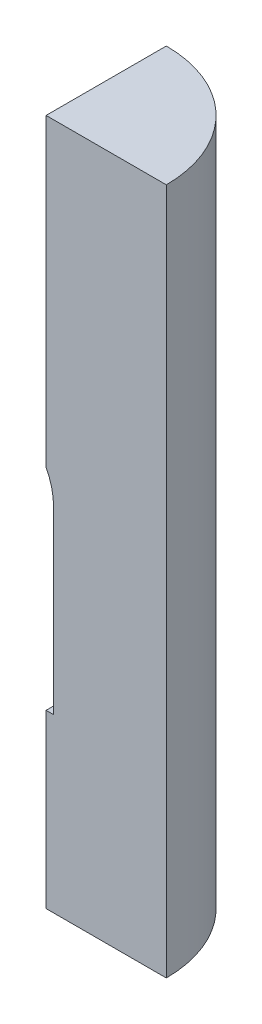
ISO-10303-21;
HEADER;
FILE_DESCRIPTION(('STEP AP214'),'2;1');
FILE_NAME('part.step','',(''),(''),'','','');
FILE_SCHEMA(('AUTOMOTIVE_DESIGN { 1 0 10303 214 1 1 1 1 }'));
ENDSEC;
DATA;
#1=APPLICATION_CONTEXT('core data for automotive mechanical design processes');
#2=APPLICATION_PROTOCOL_DEFINITION('international standard','automotive_design',2000,#1);
#3=PRODUCT_CONTEXT('',#1,'mechanical');
#4=PRODUCT('Part','Part','',(#3));
#5=PRODUCT_RELATED_PRODUCT_CATEGORY('part','',(#4));
#6=PRODUCT_DEFINITION_FORMATION('','',#4);
#7=PRODUCT_DEFINITION_CONTEXT('part definition',#1,'design');
#8=PRODUCT_DEFINITION('design','',#6,#7);
#9=PRODUCT_DEFINITION_SHAPE('','',#8);
#10=(LENGTH_UNIT() NAMED_UNIT(*) SI_UNIT(.MILLI.,.METRE.));
#11=(NAMED_UNIT(*) PLANE_ANGLE_UNIT() SI_UNIT($,.RADIAN.));
#12=(NAMED_UNIT(*) SI_UNIT($,.STERADIAN.) SOLID_ANGLE_UNIT());
#13=UNCERTAINTY_MEASURE_WITH_UNIT(LENGTH_MEASURE(1.E-05),#10,'distance_accuracy_value','');
#14=(GEOMETRIC_REPRESENTATION_CONTEXT(3) GLOBAL_UNCERTAINTY_ASSIGNED_CONTEXT((#13)) GLOBAL_UNIT_ASSIGNED_CONTEXT((#10,
#11,#12)) REPRESENTATION_CONTEXT('',''));
#15=CARTESIAN_POINT('',(0.,0.,0.));
#16=DIRECTION('',(0.,0.,1.));
#17=DIRECTION('',(1.,0.,0.));
#18=AXIS2_PLACEMENT_3D('',#15,#16,#17);
#19=CARTESIAN_POINT('',(0.,3000.,0.));
#20=DIRECTION('',(1.,0.,0.));
#21=DIRECTION('',(0.,0.,-1.));
#22=AXIS2_PLACEMENT_3D('',#19,#20,#21);
#23=PLANE('',#22);
#24=DIRECTION('',(0.,0.,1.));
#25=VECTOR('',#24,1.);
#26=CARTESIAN_POINT('',(0.,0.,0.));
#27=LINE('',#26,#25);
#28=CARTESIAN_POINT('',(0.,0.,-43.5));
#29=VERTEX_POINT('',#28);
#30=CARTESIAN_POINT('',(0.,0.,0.));
#31=VERTEX_POINT('',#30);
#32=EDGE_CURVE('E444',#29,#31,#27,.T.);
#33=ORIENTED_EDGE('',*,*,#32,.F.);
#34=DIRECTION('',(0.,1.,0.));
#35=VECTOR('',#34,1.);
#36=CARTESIAN_POINT('',(0.,1225.,-43.5));
#37=LINE('',#36,#35);
#38=CARTESIAN_POINT('',(0.,1050.,-43.5));
#39=VERTEX_POINT('',#38);
#40=EDGE_CURVE('E437',#39,#29,#37,.F.);
#41=ORIENTED_EDGE('',*,*,#40,.F.);
#42=CARTESIAN_POINT('',(0.,1050.,330.261494252874));
#43=DIRECTION('',(1.,0.,0.));
#44=DIRECTION('',(0.,0.,-1.));
#45=AXIS2_PLACEMENT_3D('',#42,#43,#44);
#46=CIRCLE('',#45,373.761494252874);
#47=CARTESIAN_POINT('',(0.,1225.,0.));
#48=VERTEX_POINT('',#47);
#49=EDGE_CURVE('E440',#48,#39,#46,.F.);
#50=ORIENTED_EDGE('',*,*,#49,.F.);
#51=DIRECTION('',(0.,-1.,0.));
#52=VECTOR('',#51,1.);
#53=CARTESIAN_POINT('',(0.,3000.,0.));
#54=LINE('',#53,#52);
#55=CARTESIAN_POINT('',(0.,3000.,0.));
#56=VERTEX_POINT('',#55);
#57=EDGE_CURVE('E467',#56,#48,#54,.T.);
#58=ORIENTED_EDGE('',*,*,#57,.F.);
#59=DIRECTION('',(0.,0.,1.));
#60=VECTOR('',#59,1.);
#61=CARTESIAN_POINT('',(0.,3000.,0.));
#62=LINE('',#61,#60);
#63=CARTESIAN_POINT('',(0.,3000.,-700.));
#64=VERTEX_POINT('',#63);
#65=EDGE_CURVE('E455',#64,#56,#62,.T.);
#66=ORIENTED_EDGE('',*,*,#65,.F.);
#67=DIRECTION('',(0.,-1.,0.));
#68=VECTOR('',#67,1.);
#69=CARTESIAN_POINT('',(0.,3000.,-700.));
#70=LINE('',#69,#68);
#71=CARTESIAN_POINT('',(0.,-1000.,-700.));
#72=VERTEX_POINT('',#71);
#73=EDGE_CURVE('E462',#64,#72,#70,.T.);
#74=ORIENTED_EDGE('',*,*,#73,.T.);
#75=DIRECTION('',(0.,0.,1.));
#76=VECTOR('',#75,1.);
#77=CARTESIAN_POINT('',(0.,-1000.,0.));
#78=LINE('',#77,#76);
#79=CARTESIAN_POINT('',(0.,-1000.,0.));
#80=VERTEX_POINT('',#79);
#81=EDGE_CURVE('E446',#72,#80,#78,.T.);
#82=ORIENTED_EDGE('',*,*,#81,.T.);
#83=EDGE_CURVE('E466',#31,#80,#54,.T.);
#84=ORIENTED_EDGE('',*,*,#83,.F.);
#85=EDGE_LOOP('',(#33,#41,#50,#58,#66,#74,#82,#84));
#86=FACE_BOUND('',#85,.T.);
#87=ADVANCED_FACE('F97',(#86),#23,.F.);
#88=CARTESIAN_POINT('',(700.,3000.,0.));
#89=DIRECTION('',(0.,0.,-1.));
#90=DIRECTION('',(-1.,0.,0.));
#91=AXIS2_PLACEMENT_3D('',#88,#89,#90);
#92=PLANE('',#91);
#93=DIRECTION('',(1.,0.,0.));
#94=VECTOR('',#93,1.);
#95=CARTESIAN_POINT('',(700.,0.,0.));
#96=LINE('',#95,#94);
#97=CARTESIAN_POINT('',(43.5,0.,0.));
#98=VERTEX_POINT('',#97);
#99=EDGE_CURVE('E399',#31,#98,#96,.T.);
#100=ORIENTED_EDGE('',*,*,#99,.F.);
#101=ORIENTED_EDGE('',*,*,#83,.T.);
#102=DIRECTION('',(1.,0.,0.));
#103=VECTOR('',#102,1.);
#104=CARTESIAN_POINT('',(700.,-1000.,0.));
#105=LINE('',#104,#103);
#106=CARTESIAN_POINT('',(700.,-1000.,0.));
#107=VERTEX_POINT('',#106);
#108=EDGE_CURVE('E449',#80,#107,#105,.T.);
#109=ORIENTED_EDGE('',*,*,#108,.T.);
#110=DIRECTION('',(0.,-1.,0.));
#111=VECTOR('',#110,1.);
#112=CARTESIAN_POINT('',(700.,3000.,0.));
#113=LINE('',#112,#111);
#114=CARTESIAN_POINT('',(700.,3000.,0.));
#115=VERTEX_POINT('',#114);
#116=EDGE_CURVE('E464',#115,#107,#113,.T.);
#117=ORIENTED_EDGE('',*,*,#116,.F.);
#118=DIRECTION('',(1.,0.,0.));
#119=VECTOR('',#118,1.);
#120=CARTESIAN_POINT('',(700.,3000.,0.));
#121=LINE('',#120,#119);
#122=EDGE_CURVE('E458',#56,#115,#121,.T.);
#123=ORIENTED_EDGE('',*,*,#122,.F.);
#124=ORIENTED_EDGE('',*,*,#57,.T.);
#125=CARTESIAN_POINT('',(-330.261494252874,1050.,0.));
#126=DIRECTION('',(0.,0.,-1.));
#127=DIRECTION('',(-1.,0.,0.));
#128=AXIS2_PLACEMENT_3D('',#125,#126,#127);
#129=CIRCLE('',#128,373.761494252874);
#130=CARTESIAN_POINT('',(43.5,1050.,0.));
#131=VERTEX_POINT('',#130);
#132=EDGE_CURVE('E470',#131,#48,#129,.F.);
#133=ORIENTED_EDGE('',*,*,#132,.F.);
#134=DIRECTION('',(0.,1.,0.));
#135=VECTOR('',#134,1.);
#136=CARTESIAN_POINT('',(43.5,1225.,0.));
#137=LINE('',#136,#135);
#138=EDGE_CURVE('E471',#98,#131,#137,.T.);
#139=ORIENTED_EDGE('',*,*,#138,.F.);
#140=EDGE_LOOP('',(#100,#101,#109,#117,#123,#124,#133,#139));
#141=FACE_BOUND('',#140,.T.);
#142=ADVANCED_FACE('F477',(#141),#92,.F.);
#143=CARTESIAN_POINT('',(0.,3000.,0.));
#144=DIRECTION('',(0.,-1.,0.));
#145=DIRECTION('',(0.,0.,-1.));
#146=AXIS2_PLACEMENT_3D('',#143,#144,#145);
#147=CYLINDRICAL_SURFACE('',#146,700.);
#148=ORIENTED_EDGE('',*,*,#116,.T.);
#149=CARTESIAN_POINT('',(0.,-1000.,0.));
#150=DIRECTION('',(0.,1.,0.));
#151=DIRECTION('',(0.,0.,1.));
#152=AXIS2_PLACEMENT_3D('',#149,#150,#151);
#153=CIRCLE('',#152,700.);
#154=EDGE_CURVE('E452',#107,#72,#153,.T.);
#155=ORIENTED_EDGE('',*,*,#154,.T.);
#156=ORIENTED_EDGE('',*,*,#73,.F.);
#157=CARTESIAN_POINT('',(0.,3000.,0.));
#158=DIRECTION('',(0.,1.,0.));
#159=DIRECTION('',(0.,0.,1.));
#160=AXIS2_PLACEMENT_3D('',#157,#158,#159);
#161=CIRCLE('',#160,700.);
#162=EDGE_CURVE('E460',#115,#64,#161,.T.);
#163=ORIENTED_EDGE('',*,*,#162,.F.);
#164=EDGE_LOOP('',(#148,#155,#156,#163));
#165=FACE_BOUND('',#164,.T.);
#166=ADVANCED_FACE('F490',(#165),#147,.T.);
#167=CARTESIAN_POINT('',(0.,3000.,0.));
#168=DIRECTION('',(0.,1.,0.));
#169=DIRECTION('',(0.,0.,1.));
#170=AXIS2_PLACEMENT_3D('',#167,#168,#169);
#171=PLANE('',#170);
#172=ORIENTED_EDGE('',*,*,#65,.T.);
#173=ORIENTED_EDGE('',*,*,#122,.T.);
#174=ORIENTED_EDGE('',*,*,#162,.T.);
#175=EDGE_LOOP('',(#172,#173,#174));
#176=FACE_BOUND('',#175,.T.);
#177=ADVANCED_FACE('F493',(#176),#171,.T.);
#178=CARTESIAN_POINT('',(0.,-1000.,0.));
#179=DIRECTION('',(0.,1.,0.));
#180=DIRECTION('',(0.,0.,1.));
#181=AXIS2_PLACEMENT_3D('',#178,#179,#180);
#182=PLANE('',#181);
#183=ORIENTED_EDGE('',*,*,#81,.F.);
#184=ORIENTED_EDGE('',*,*,#154,.F.);
#185=ORIENTED_EDGE('',*,*,#108,.F.);
#186=EDGE_LOOP('',(#183,#184,#185));
#187=FACE_BOUND('',#186,.T.);
#188=ADVANCED_FACE('F487',(#187),#182,.F.);
#189=CARTESIAN_POINT('',(0.,0.,0.));
#190=DIRECTION('',(0.,1.,0.));
#191=DIRECTION('',(0.,0.,1.));
#192=AXIS2_PLACEMENT_3D('',#189,#190,#191);
#193=PLANE('',#192);
#194=ORIENTED_EDGE('',*,*,#32,.T.);
#195=ORIENTED_EDGE('',*,*,#99,.T.);
#196=CARTESIAN_POINT('',(0.,0.,0.));
#197=DIRECTION('',(0.,1.,0.));
#198=DIRECTION('',(0.,0.,1.));
#199=AXIS2_PLACEMENT_3D('',#196,#197,#198);
#200=CIRCLE('',#199,43.5);
#201=CARTESIAN_POINT('',(31.4581230245567,0.,-30.0439094621831));
#202=VERTEX_POINT('',#201);
#203=EDGE_CURVE('E422',#98,#202,#200,.T.);
#204=ORIENTED_EDGE('',*,*,#203,.T.);
#205=DIRECTION('',(0.707106781186554,0.,-0.707106781186541));
#206=VECTOR('',#205,1.);
#207=CARTESIAN_POINT('',(74.9533188057747,0.,-73.5391052434003));
#208=LINE('',#207,#206);
#209=CARTESIAN_POINT('',(149.199530830363,0.,-147.785317267987));
#210=VERTEX_POINT('',#209);
#211=EDGE_CURVE('E223',#202,#210,#208,.T.);
#212=ORIENTED_EDGE('',*,*,#211,.T.);
#213=DIRECTION('',(-0.707106781186547,0.,-0.707106781186547));
#214=VECTOR('',#213,1.);
#215=CARTESIAN_POINT('',(147.78531726799,0.,-149.19953083036));
#216=LINE('',#215,#214);
#217=CARTESIAN_POINT('',(147.78531726799,0.,-149.19953083036));
#218=VERTEX_POINT('',#217);
#219=EDGE_CURVE('E281',#210,#218,#216,.T.);
#220=ORIENTED_EDGE('',*,*,#219,.T.);
#221=DIRECTION('',(-0.707106781186554,0.,0.707106781186541));
#222=VECTOR('',#221,1.);
#223=CARTESIAN_POINT('',(73.5391052434016,0.,-74.9533188057734));
#224=LINE('',#223,#222);
#225=CARTESIAN_POINT('',(30.0439094621836,0.,-31.4581230245562));
#226=VERTEX_POINT('',#225);
#227=EDGE_CURVE('E364',#218,#226,#224,.T.);
#228=ORIENTED_EDGE('',*,*,#227,.T.);
#229=EDGE_CURVE('E435',#226,#29,#200,.T.);
#230=ORIENTED_EDGE('',*,*,#229,.T.);
#231=EDGE_LOOP('',(#194,#195,#204,#212,#220,#228,#230));
#232=FACE_BOUND('',#231,.T.);
#233=ADVANCED_FACE('F404',(#232),#193,.T.);
#234=CARTESIAN_POINT('',(0.,1225.,0.));
#235=DIRECTION('',(0.,1.,0.));
#236=DIRECTION('',(0.,0.,1.));
#237=AXIS2_PLACEMENT_3D('',#234,#235,#236);
#238=CYLINDRICAL_SURFACE('',#237,43.5);
#239=CARTESIAN_POINT('',(31.4581230245567,0.,-30.0439094621831));
#240=CARTESIAN_POINT('',(31.5658679017557,1.24177976317339,-29.9310907334763));
#241=CARTESIAN_POINT('',(31.6691032084224,2.48427472720864,-29.8217828292401));
#242=CARTESIAN_POINT('',(31.8664585476178,4.97066705871609,-29.6108041272958));
#243=CARTESIAN_POINT('',(31.9605783515092,6.21456446057334,-29.5091335211624));
#244=CARTESIAN_POINT('',(32.1396018071558,8.70368068165048,-29.3140498645286));
#245=CARTESIAN_POINT('',(32.2245053900726,9.9488995106703,-29.2206368757074));
#246=CARTESIAN_POINT('',(32.3850610344528,12.4401919203471,-29.0425927501225));
#247=CARTESIAN_POINT('',(32.4607158102099,13.6862651417846,-28.9579590379703));
#248=CARTESIAN_POINT('',(32.6028801142698,16.1795051961954,-28.7978067813483));
#249=CARTESIAN_POINT('',(32.6693897404492,17.4266720173206,-28.7222881393249));
#250=CARTESIAN_POINT('',(32.7934522595879,19.9219622394534,-28.5805592356351));
#251=CARTESIAN_POINT('',(32.8510052822949,21.1700856263408,-28.5143488391285));
#252=CARTESIAN_POINT('',(32.944287726564,23.3579649078937,-28.4064718784471));
#253=CARTESIAN_POINT('',(32.9818920624438,24.2975425698529,-28.3627876827162));
#254=CARTESIAN_POINT('',(33.052392924862,26.1770972615826,-28.2805985703607));
#255=CARTESIAN_POINT('',(33.0852894702768,27.1170742897368,-28.2420936329696));
#256=CARTESIAN_POINT('',(33.1465973569412,28.997394783179,-28.1701139759049));
#257=CARTESIAN_POINT('',(33.1750085638879,29.9377382585945,-28.1366394068555));
#258=CARTESIAN_POINT('',(33.2276075262772,31.8187006398863,-28.0745034064884));
#259=CARTESIAN_POINT('',(33.2517952799631,32.7593195458768,-28.0458419771726));
#260=CARTESIAN_POINT('',(33.3184897877791,35.5827937990007,-27.9666426722113));
#261=CARTESIAN_POINT('',(33.3550868127822,37.465986202406,-27.9229381037208));
#262=CARTESIAN_POINT('',(33.4001902419075,40.2910818077565,-27.8689396558382));
#263=CARTESIAN_POINT('',(33.4135925046503,41.2328098556127,-27.8528668106838));
#264=CARTESIAN_POINT('',(33.4375020180265,43.1163482017773,-27.8241586227947));
#265=CARTESIAN_POINT('',(33.4480092911929,44.0581584993884,-27.8115232533044));
#266=CARTESIAN_POINT('',(33.45725341633,45.,-27.8003991668371));
#267=B_SPLINE_CURVE_WITH_KNOTS('',3,(#239,#240,#241,#242,#243,#244,#245,#246,#247,#248,#249,
#250,#251,#252,#253,#254,#255,#256,#257,#258,#259,#260,#261,#262,#263,#264,#265,#266),
.UNSPECIFIED.,.F.,.F.,(4,2,2,2,2,2,2,2,2,2,2,2,2,4),(0.,3.75461604501425,7.50932623980405,
11.264064477528,15.0176981345144,18.7712916147766,22.5248307144129,25.3488375655475,
28.1728330932444,30.9969131628654,33.8209944070744,39.473002736639,42.298876970043,
45.1247292077212),.UNSPECIFIED.);
#268=CARTESIAN_POINT('',(33.45725341633,45.,-27.8003991668371));
#269=VERTEX_POINT('',#268);
#270=EDGE_CURVE('E12',#202,#269,#267,.T.);
#271=ORIENTED_EDGE('',*,*,#270,.F.);
#272=ORIENTED_EDGE('',*,*,#203,.F.);
#273=ORIENTED_EDGE('',*,*,#138,.T.);
#274=CARTESIAN_POINT('',(0.,1050.,0.));
#275=DIRECTION('',(0.,1.,0.));
#276=DIRECTION('',(0.,0.,1.));
#277=AXIS2_PLACEMENT_3D('',#274,#275,#276);
#278=CIRCLE('',#277,43.5);
#279=EDGE_CURVE('E123',#131,#39,#278,.T.);
#280=ORIENTED_EDGE('',*,*,#279,.T.);
#281=ORIENTED_EDGE('',*,*,#40,.T.);
#282=ORIENTED_EDGE('',*,*,#229,.F.);
#283=CARTESIAN_POINT('',(27.8003991668377,45.,-33.4572534163295));
#284=CARTESIAN_POINT('',(27.8114811354851,44.0617252547619,-33.4480443010678));
#285=CARTESIAN_POINT('',(27.8240629420879,43.1234814752266,-33.4375815880387));
#286=CARTESIAN_POINT('',(27.8526364785004,41.2470754848527,-33.4137844535729));
#287=CARTESIAN_POINT('',(27.8686282345096,40.3089132746961,-33.4004500100718));
#288=CARTESIAN_POINT('',(27.9223351601999,37.4945142229592,-33.3555911746074));
#289=CARTESIAN_POINT('',(27.9657810483607,35.6184508406629,-33.319212053824));
#290=CARTESIAN_POINT('',(28.0444942598446,32.8049739496782,-33.2529317588171));
#291=CARTESIAN_POINT('',(28.0729902960158,31.8672273623894,-33.2288856263564));
#292=CARTESIAN_POINT('',(28.134761628662,29.9920068849384,-33.17660077028));
#293=CARTESIAN_POINT('',(28.1680369230724,29.0545329946585,-33.1483620484757));
#294=CARTESIAN_POINT('',(28.2395833937317,27.1799480743054,-33.0874316751254));
#295=CARTESIAN_POINT('',(28.2778544209276,26.2428370342426,-33.0547401564321));
#296=CARTESIAN_POINT('',(28.3595412273874,24.3690102698242,-32.9846830253023));
#297=CARTESIAN_POINT('',(28.4029570275142,23.4322945470872,-32.9473173939116));
#298=CARTESIAN_POINT('',(28.5105682775678,21.2429720462516,-32.8542864414645));
#299=CARTESIAN_POINT('',(28.576828906845,19.9905470290295,-32.7967032826214));
#300=CARTESIAN_POINT('',(28.7187240836822,17.4866575825602,-32.6725231333784));
#301=CARTESIAN_POINT('',(28.7943587683986,16.2351931676377,-32.6059260110893));
#302=CARTESIAN_POINT('',(28.9548097932481,13.7333636832191,-32.4635255805636));
#303=CARTESIAN_POINT('',(29.0396262323146,12.4829986257149,-32.3877221731283));
#304=CARTESIAN_POINT('',(29.2181008885432,9.98312552493623,-32.2268058427052));
#305=CARTESIAN_POINT('',(29.3117617220858,8.73361784609797,-32.1416901637393));
#306=CARTESIAN_POINT('',(29.5074018483214,6.23593249611963,-31.9621786499106));
#307=CARTESIAN_POINT('',(29.6093810787719,4.98775481509857,-31.8677828844853));
#308=CARTESIAN_POINT('',(29.8210317620673,2.49281138396207,-31.6698125183095));
#309=CARTESIAN_POINT('',(29.9307030213159,1.24604559911337,-31.5662381485528));
#310=CARTESIAN_POINT('',(30.0439094621836,0.,-31.4581230245562));
#311=B_SPLINE_CURVE_WITH_KNOTS('',3,(#283,#284,#285,#286,#287,#288,#289,#290,#291,#292,#293,
#294,#295,#296,#297,#298,#299,#300,#301,#302,#303,#304,#305,#306,#307,#308,#309,#310),
.UNSPECIFIED.,.F.,.F.,(4,2,2,2,2,2,2,2,2,2,2,2,2,4),(0.,2.81515077233334,5.63032317507526,
11.2609256373549,14.0763709567371,16.8918150598655,19.7071751804828,22.5225467181959,
26.2889704345032,30.0554492657691,33.8219686848736,37.589605840786,41.357214807805,
45.1247289839901),.UNSPECIFIED.);
#312=CARTESIAN_POINT('',(27.8003991668377,45.,-33.4572534163295));
#313=VERTEX_POINT('',#312);
#314=EDGE_CURVE('E393',#313,#226,#311,.T.);
#315=ORIENTED_EDGE('',*,*,#314,.F.);
#316=DIRECTION('',(0.,1.,0.));
#317=VECTOR('',#316,1.);
#318=CARTESIAN_POINT('',(27.8003991668377,1225.,-33.4572534163295));
#319=LINE('',#318,#317);
#320=CARTESIAN_POINT('',(27.8003991668377,143.655411501133,-33.4572534163295));
#321=VERTEX_POINT('',#320);
#322=EDGE_CURVE('E362',#321,#313,#319,.F.);
#323=ORIENTED_EDGE('',*,*,#322,.F.);
#324=CARTESIAN_POINT('',(33.45725341633,143.655411501133,-27.8003991668371));
#325=CARTESIAN_POINT('',(33.4515470577323,144.11887844655,-27.8072667375344));
#326=CARTESIAN_POINT('',(33.446109957255,144.582353425147,-27.8138059079445));
#327=CARTESIAN_POINT('',(33.4356756911376,145.509313450352,-27.8263481939494));
#328=CARTESIAN_POINT('',(33.4306785234327,145.972798496903,-27.8323513120602));
#329=CARTESIAN_POINT('',(33.4065459912598,148.290239781642,-27.861328722965));
#330=CARTESIAN_POINT('',(33.3899703749463,150.144259172901,-27.8811886822571));
#331=CARTESIAN_POINT('',(33.3635741493407,152.925266114194,-27.9127584173076));
#332=CARTESIAN_POINT('',(33.3545198656276,153.852271815354,-27.923578384424));
#333=CARTESIAN_POINT('',(33.3347285967577,155.706231036058,-27.9472023468485));
#334=CARTESIAN_POINT('',(33.3239916326872,156.633184556111,-27.9600063172944));
#335=CARTESIAN_POINT('',(33.303511307198,158.178137423054,-27.9843937321158));
#336=CARTESIAN_POINT('',(33.2946290013392,158.796163726889,-27.9949622327945));
#337=CARTESIAN_POINT('',(33.2749523760363,160.032152893979,-28.0183472145238));
#338=CARTESIAN_POINT('',(33.2641580317279,160.650115756305,-28.0311637248076));
#339=CARTESIAN_POINT('',(33.2400052856425,161.885961097878,-28.0598004446263));
#340=CARTESIAN_POINT('',(33.2266467299125,162.503843570069,-28.0756208345107));
#341=CARTESIAN_POINT('',(33.1965363975602,163.73960017001,-28.1112169766466));
#342=CARTESIAN_POINT('',(33.1797836146792,164.357474240818,-28.1309939018377));
#343=CARTESIAN_POINT('',(33.1417803692364,165.592870319497,-28.1757565880198));
#344=CARTESIAN_POINT('',(33.1205301249031,166.210392342992,-28.2007420962761));
#345=CARTESIAN_POINT('',(33.0719919046352,167.444830371846,-28.2576499049373));
#346=CARTESIAN_POINT('',(33.044704615339,168.061746438116,-28.2895714164513));
#347=CARTESIAN_POINT('',(33.0015238665983,168.909672195639,-28.3398965936241));
#348=CARTESIAN_POINT('',(32.9891559340805,169.14110123836,-28.3542940062977));
#349=CARTESIAN_POINT('',(32.9630599341057,169.603782092987,-28.3846275738535));
#350=CARTESIAN_POINT('',(32.9493318699541,169.835033905323,-28.4005637249966));
#351=CARTESIAN_POINT('',(32.9203320599398,170.297357104569,-28.4341736612495));
#352=CARTESIAN_POINT('',(32.9050600451334,170.528428452956,-28.4518477490792));
#353=CARTESIAN_POINT('',(32.8727716317807,170.990290114107,-28.4891467969612));
#354=CARTESIAN_POINT('',(32.8557552205057,171.221080424809,-28.5087717712487));
#355=CARTESIAN_POINT('',(32.8016346836249,171.912683562227,-28.5710669003129));
#356=CARTESIAN_POINT('',(32.7614444050764,172.372975235038,-28.6171745176167));
#357=CARTESIAN_POINT('',(32.6925954710984,173.06140560094,-28.6957380180424));
#358=CARTESIAN_POINT('',(32.6682228435188,173.290513872834,-28.7234880284056));
#359=CARTESIAN_POINT('',(32.6159467594181,173.747825447248,-28.7828350958343));
#360=CARTESIAN_POINT('',(32.5880435578621,173.976028813891,-28.814431875094));
#361=CARTESIAN_POINT('',(32.5428919952279,174.317715060028,-28.8653891723265));
#362=CARTESIAN_POINT('',(32.527266442125,174.431675490991,-28.8829973291453));
#363=CARTESIAN_POINT('',(32.4947627169385,174.659204130163,-28.9195607807061));
#364=CARTESIAN_POINT('',(32.4778845309871,174.772772334014,-28.9385160903623));
#365=CARTESIAN_POINT('',(32.4427429922763,174.999415282767,-28.9779075067094));
#366=CARTESIAN_POINT('',(32.4244798992052,175.112490115997,-28.9983433357516));
#367=CARTESIAN_POINT('',(32.3863947284,175.338061888087,-29.0408721139456));
#368=CARTESIAN_POINT('',(32.3665727148295,175.450558850529,-29.0629649948931));
#369=CARTESIAN_POINT('',(32.3249920258726,175.675154390799,-29.1092057692281));
#370=CARTESIAN_POINT('',(32.3032274658719,175.787250609174,-29.1333598963997));
#371=CARTESIAN_POINT('',(32.2575132069934,176.010488884794,-29.1839682641249));
#372=CARTESIAN_POINT('',(32.233563319093,176.121630858589,-29.2104227036375));
#373=CARTESIAN_POINT('',(32.1832018075396,176.342611963643,-29.2659004589148));
#374=CARTESIAN_POINT('',(32.1567922759581,176.452452114129,-29.2949215905172));
#375=CARTESIAN_POINT('',(32.1008480521528,176.670410075046,-29.3562136028009));
#376=CARTESIAN_POINT('',(32.0713141053648,176.778528289252,-29.3884837082403));
#377=CARTESIAN_POINT('',(32.0240066611844,176.939627756085,-29.4399990901615));
#378=CARTESIAN_POINT('',(32.0076249066364,176.993479557411,-29.4578099968581));
#379=CARTESIAN_POINT('',(31.9738201608663,177.10049218968,-29.4944985845396));
#380=CARTESIAN_POINT('',(31.9563971353984,177.153652997828,-29.5133763006091));
#381=CARTESIAN_POINT('',(31.9204410885059,177.259246993888,-29.5522612437502));
#382=CARTESIAN_POINT('',(31.9019070249386,177.311679439989,-29.5722695302434));
#383=CARTESIAN_POINT('',(31.8635786557308,177.415567675133,-29.6135635374217));
#384=CARTESIAN_POINT('',(31.8437844014048,177.467023503832,-29.6348492060903));
#385=CARTESIAN_POINT('',(31.7824404278014,177.618785684039,-29.7006749544702));
#386=CARTESIAN_POINT('',(31.7386725363348,177.717267546962,-29.7474621532161));
#387=CARTESIAN_POINT('',(31.6435423153324,177.906255056402,-29.8486353746658));
#388=CARTESIAN_POINT('',(31.592198218431,177.996779041815,-29.9030031374103));
#389=CARTESIAN_POINT('',(31.5158341245876,178.112541867919,-29.9833801089285));
#390=CARTESIAN_POINT('',(31.4946346146979,178.142948065492,-30.0056492312158));
#391=CARTESIAN_POINT('',(31.4509998923924,178.201940380811,-30.0513828008517));
#392=CARTESIAN_POINT('',(31.4285645099137,178.230526246896,-30.0748474126727));
#393=CARTESIAN_POINT('',(31.3824094591973,178.285505500418,-30.1230059465085));
#394=CARTESIAN_POINT('',(31.3586907264575,178.311900450284,-30.147698972041));
#395=CARTESIAN_POINT('',(31.3099008494748,178.362088809489,-30.1983665988733));
#396=CARTESIAN_POINT('',(31.284829858488,178.385882512714,-30.2243410549158));
#397=CARTESIAN_POINT('',(31.232970482991,178.430697957639,-30.2779286605117));
#398=CARTESIAN_POINT('',(31.2061633153574,178.451677389028,-30.3055593493969));
#399=CARTESIAN_POINT('',(31.1511895946496,178.489848631524,-30.3620641252165));
#400=CARTESIAN_POINT('',(31.1230232139483,178.507040921379,-30.3909380544356));
#401=CARTESIAN_POINT('',(31.0655601941963,178.537386821453,-30.4496741522788));
#402=CARTESIAN_POINT('',(31.0362634298416,178.550539982474,-30.47953643041));
#403=CARTESIAN_POINT('',(30.9768418857456,178.572812076532,-30.5399257855103));
#404=CARTESIAN_POINT('',(30.9467169414662,178.581930201668,-30.5704529943304));
#405=CARTESIAN_POINT('',(30.8621762178756,178.601580365456,-30.6558635436248));
#406=CARTESIAN_POINT('',(30.8071174951902,178.607681400813,-30.711196618487));
#407=CARTESIAN_POINT('',(30.6967784969105,178.606528545782,-30.8214839487795));
#408=CARTESIAN_POINT('',(30.6414982723205,178.599277571324,-30.8764382842917));
#409=CARTESIAN_POINT('',(30.5597595177021,178.578745389148,-30.9572701387431));
#410=CARTESIAN_POINT('',(30.5327505884032,178.570312269434,-30.983907975149));
#411=CARTESIAN_POINT('',(30.4792671719823,178.550271783189,-31.0365216332355));
#412=CARTESIAN_POINT('',(30.4527925591501,178.538665172869,-31.0624976110202));
#413=CARTESIAN_POINT('',(30.4006065069956,178.512292603178,-31.1135735264817));
#414=CARTESIAN_POINT('',(30.3748947455256,178.497527999671,-31.1386738347594));
#415=CARTESIAN_POINT('',(30.3244230999303,178.464947531575,-31.187827856711));
#416=CARTESIAN_POINT('',(30.2996633628766,178.447131197844,-31.2118814087539));
#417=CARTESIAN_POINT('',(30.2431459269935,178.402560768675,-31.266661849433));
#418=CARTESIAN_POINT('',(30.211777773159,178.374798177364,-31.2969690087456));
#419=CARTESIAN_POINT('',(30.1508688905576,178.315478147979,-31.3556517485245));
#420=CARTESIAN_POINT('',(30.1213292722528,178.283918437517,-31.3840261562687));
#421=CARTESIAN_POINT('',(30.0639371689233,178.217661189857,-31.4390086591276));
#422=CARTESIAN_POINT('',(30.036089747364,178.182954941969,-31.465611473986));
#423=CARTESIAN_POINT('',(29.9821087384015,178.111027713583,-31.5170516209043));
#424=CARTESIAN_POINT('',(29.9559747477136,178.073807329045,-31.5418893685186));
#425=CARTESIAN_POINT('',(29.8873716446666,177.969900703739,-31.6069389567288));
#426=CARTESIAN_POINT('',(29.8465225480641,177.9011058505,-31.6455037430134));
#427=CARTESIAN_POINT('',(29.7692251190196,177.758859298743,-31.7182290233989));
#428=CARTESIAN_POINT('',(29.7327808790234,177.685403364877,-31.7523854237432));
#429=CARTESIAN_POINT('',(29.6635699022373,177.535085417576,-31.8170530972705));
#430=CARTESIAN_POINT('',(29.630809412503,177.458217917533,-31.8475581838884));
#431=CARTESIAN_POINT('',(29.5839143837076,177.341241554972,-31.8911031556346));
#432=CARTESIAN_POINT('',(29.5686590557768,177.301976105362,-31.9052474656636));
#433=CARTESIAN_POINT('',(29.5387944104747,177.222976649101,-31.9328990044479));
#434=CARTESIAN_POINT('',(29.5241851006718,177.183242636969,-31.9464062257396));
#435=CARTESIAN_POINT('',(29.4774630206006,177.052696449102,-31.9895471420342));
#436=CARTESIAN_POINT('',(29.446643323091,176.960998041338,-32.0179135833319));
#437=CARTESIAN_POINT('',(29.3878646145971,176.775879880158,-32.0718724651711));
#438=CARTESIAN_POINT('',(29.3599061495242,176.682459802253,-32.0974643763988));
#439=CARTESIAN_POINT('',(29.3064194080698,176.494151025109,-32.1463076608745));
#440=CARTESIAN_POINT('',(29.2808952356495,176.399260148693,-32.1695550852248));
#441=CARTESIAN_POINT('',(29.2318776814253,176.208513053786,-32.2141028225997));
#442=CARTESIAN_POINT('',(29.2083842083792,176.112656878884,-32.2354032231094));
#443=CARTESIAN_POINT('',(29.1631633552781,175.920072823785,-32.2763200140224));
#444=CARTESIAN_POINT('',(29.1414376911996,175.823344195518,-32.2959347692162));
#445=CARTESIAN_POINT('',(29.0995950076407,175.629246823793,-32.333641356441));
#446=CARTESIAN_POINT('',(29.0794779869098,175.53187808083,-32.3517331896557));
#447=CARTESIAN_POINT('',(29.0405437217206,175.336107587106,-32.3866872159436));
#448=CARTESIAN_POINT('',(29.0217339692912,175.23770309653,-32.4035423479058));
#449=CARTESIAN_POINT('',(28.9853295472232,175.040482780895,-32.4361105058922));
#450=CARTESIAN_POINT('',(28.9677348799528,174.941666955036,-32.4518235296905));
#451=CARTESIAN_POINT('',(28.9166818251895,174.644935967307,-32.4973476223744));
#452=CARTESIAN_POINT('',(28.8849055835846,174.44648853923,-32.5255874697307));
#453=CARTESIAN_POINT('',(28.8250141692288,174.048680349189,-32.5786763086933));
#454=CARTESIAN_POINT('',(28.796897646303,173.849319952306,-32.6035265509849));
#455=CARTESIAN_POINT('',(28.7465904829445,173.471449859049,-32.6478871407372));
#456=CARTESIAN_POINT('',(28.7240878069521,173.293014913959,-32.6676843419223));
#457=CARTESIAN_POINT('',(28.6811513946292,172.935695231161,-32.705387424771));
#458=CARTESIAN_POINT('',(28.6607177091626,172.756810482507,-32.723293259938));
#459=CARTESIAN_POINT('',(28.6021248822919,172.21958844697,-32.7745506439176));
#460=CARTESIAN_POINT('',(28.5666785777523,171.860718872572,-32.8054380165436));
#461=CARTESIAN_POINT('',(28.5013785372523,171.141818590269,-32.8621860998438));
#462=CARTESIAN_POINT('',(28.4715290766698,170.781787206688,-32.8880429683242));
#463=CARTESIAN_POINT('',(28.4162750216646,170.061146087752,-32.9357957595774));
#464=CARTESIAN_POINT('',(28.3908701836428,169.700536385188,-32.9576918994304));
#465=CARTESIAN_POINT('',(28.343855726791,168.980201525663,-32.9981332859298));
#466=CARTESIAN_POINT('',(28.3222327071196,168.620477889862,-33.0166903715098));
#467=CARTESIAN_POINT('',(28.2819351693983,167.900739830392,-33.0512154453543));
#468=CARTESIAN_POINT('',(28.2632606864776,167.54072540331,-33.0671834027719));
#469=CARTESIAN_POINT('',(28.2284555179304,166.820614304165,-33.0969005119925));
#470=CARTESIAN_POINT('',(28.2123239156754,166.460517708812,-33.1106504633589));
#471=CARTESIAN_POINT('',(28.1821574243806,165.740171367752,-33.1363304066651));
#472=CARTESIAN_POINT('',(28.1681225462932,165.379921621256,-33.1482603890982));
#473=CARTESIAN_POINT('',(28.1390791053078,164.58306189412,-33.1729206647599));
#474=CARTESIAN_POINT('',(28.1244929963362,164.146425339954,-33.1852860754753));
#475=CARTESIAN_POINT('',(28.09747070804,163.273037667753,-33.2081684003064));
#476=CARTESIAN_POINT('',(28.0850345351303,162.83628654938,-33.2186853089066));
#477=CARTESIAN_POINT('',(28.0503906176918,161.525827963723,-33.2479551325488));
#478=CARTESIAN_POINT('',(28.0308503842807,160.651999388495,-33.2644246793733));
#479=CARTESIAN_POINT('',(27.9964866205993,158.903663215509,-33.2933510355609));
#480=CARTESIAN_POINT('',(27.981665952524,158.0291555269,-33.3058054099668));
#481=CARTESIAN_POINT('',(27.9550398909278,156.280091424092,-33.3281569469517));
#482=CARTESIAN_POINT('',(27.9432344018174,155.405535012316,-33.338054190599));
#483=CARTESIAN_POINT('',(27.9210046296695,153.635486221307,-33.3566742181246));
#484=CARTESIAN_POINT('',(27.9106201002737,152.739993021417,-33.3653632795154));
#485=CARTESIAN_POINT('',(27.8903618813788,150.948990197256,-33.3822989258621));
#486=CARTESIAN_POINT('',(27.8804881961355,150.053480572911,-33.3905455071317));
#487=CARTESIAN_POINT('',(27.8500376076092,147.367242409875,-33.4159565364997));
#488=CARTESIAN_POINT('',(27.8286283518432,145.576525290363,-33.4337946319023));
#489=CARTESIAN_POINT('',(27.8016860306473,143.742421118316,-33.4561840966072));
#490=CARTESIAN_POINT('',(27.8010440703645,143.698916274202,-33.4567175474716));
#491=CARTESIAN_POINT('',(27.8003991668377,143.655411501133,-33.4572534163295));
#492=B_SPLINE_CURVE_WITH_KNOTS('',3,(#324,#325,#326,#327,#328,#329,#330,#331,#332,#333,#334,
#335,#336,#337,#338,#339,#340,#341,#342,#343,#344,#345,#346,#347,#348,#349,#350,#351,#352,#353,
#354,#355,#356,#357,#358,#359,#360,#361,#362,#363,#364,#365,#366,#367,#368,#369,#370,#371,#372,
#373,#374,#375,#376,#377,#378,#379,#380,#381,#382,#383,#384,#385,#386,#387,#388,#389,#390,#391,
#392,#393,#394,#395,#396,#397,#398,#399,#400,#401,#402,#403,#404,#405,#406,#407,#408,#409,#410,
#411,#412,#413,#414,#415,#416,#417,#418,#419,#420,#421,#422,#423,#424,#425,#426,#427,#428,#429,
#430,#431,#432,#433,#434,#435,#436,#437,#438,#439,#440,#441,#442,#443,#444,#445,#446,#447,#448,
#449,#450,#451,#452,#453,#454,#455,#456,#457,#458,#459,#460,#461,#462,#463,#464,#465,#466,#467,
#468,#469,#470,#471,#472,#473,#474,#475,#476,#477,#478,#479,#480,#481,#482,#483,#484,#485,#486,
#487,#488,#489,#490,#491),.UNSPECIFIED.,.F.,.F.,(4,2,2,2,2,2,2,2,2,2,2,2,2,2,2,2,2,2,2,2,2,2,2,
2,2,2,2,2,2,2,2,2,2,2,2,2,2,2,2,2,2,2,2,2,2,2,2,2,2,2,2,2,2,2,2,2,2,2,2,2,2,2,2,2,2,2,2,2,2,2,2,
2,2,2,2,2,2,2,2,2,2,2,2,4),(0.,1.3906585043298,2.78131048136539,8.3439033900456,
11.1252423200989,13.9065463992052,15.7610828722782,17.6156434635741,19.4703154358433,
21.3255380541965,23.1806706730234,25.0355924020969,25.7322034860551,26.428812877237,
27.1255438219114,27.8222798508877,29.215009000985,29.9111661205783,30.607272994918,
30.9563609574488,31.3054527852967,31.6544793149575,32.0034914865422,32.3535993508935,
32.703737527013,33.0535805634785,33.4033403203941,33.5804381243137,33.7575417559096,
33.9348141903451,34.1120794109443,34.4640133711355,34.8151137902167,34.9447814389646,
35.0744669754896,35.2040592190361,35.3336368061772,35.4649846320465,35.5963158441789,
35.7276616565825,35.8590337553732,36.0927363976847,36.3263880079848,36.4428582486989,
36.5593007598968,36.6756933772235,36.7921039035771,36.946961489679,37.1019122157105,
37.2573058204686,37.4126627184502,37.6786497423997,37.9448820192162,38.211559183245,
38.344858836195,38.4781600503877,38.7804753482803,39.0828482195675,39.3857221675775,
39.6885824999494,39.9917333902339,40.2948840448634,40.5996490346902,40.9044146184721,
41.513174412605,42.1217089774105,42.6644865593345,43.207277481627,44.2929673717343,
45.3794832613729,46.4659395830252,47.5484644180439,48.6310021493757,49.7131487630993,
50.7953010293434,52.1064541785384,53.4176112397626,56.0401779740909,58.6643321565368,
61.288403135751,63.9751886062104,66.6619964568919,72.0347742094761,72.1653127603592),.UNSPECIFIED.);
#493=CARTESIAN_POINT('',(33.45725341633,143.655411501133,-27.8003991668371));
#494=VERTEX_POINT('',#493);
#495=EDGE_CURVE('E410',#494,#321,#492,.T.);
#496=ORIENTED_EDGE('',*,*,#495,.F.);
#497=DIRECTION('',(0.,1.,0.));
#498=VECTOR('',#497,1.);
#499=CARTESIAN_POINT('',(33.45725341633,1225.,-27.8003991668371));
#500=LINE('',#499,#498);
#501=EDGE_CURVE('E107',#269,#494,#500,.T.);
#502=ORIENTED_EDGE('',*,*,#501,.F.);
#503=EDGE_LOOP('',(#271,#272,#273,#280,#281,#282,#315,#323,#496,#502));
#504=FACE_BOUND('',#503,.T.);
#505=ADVANCED_FACE('F401',(#504),#238,.F.);
#506=CARTESIAN_POINT('',(0.,1050.,-330.261494252874));
#507=DIRECTION('',(-1.,0.,0.));
#508=DIRECTION('',(0.,0.,1.));
#509=AXIS2_PLACEMENT_3D('',#506,#507,#508);
#510=CIRCLE('',#509,373.761494252874);
#511=TRIMMED_CURVE('',#510,(PARAMETER_VALUE(-0.487267348050631)),
(PARAMETER_VALUE(0.487267348050631)),.T.,.PARAMETER.);
#512=CARTESIAN_POINT('',(0.,1050.,0.));
#513=DIRECTION('',(0.,1.,0.));
#514=AXIS1_PLACEMENT('',#512,#513);
#515=SURFACE_OF_REVOLUTION('',#511,#514);
#516=ORIENTED_EDGE('',*,*,#49,.T.);
#517=ORIENTED_EDGE('',*,*,#279,.F.);
#518=ORIENTED_EDGE('',*,*,#132,.T.);
#519=EDGE_LOOP('',(#516,#517,#518));
#520=FACE_BOUND('',#519,.T.);
#521=ADVANCED_FACE('F235',(#520),#515,.F.);
#522=CARTESIAN_POINT('',(150.967297783329,124.0625,-146.017550315021));
#523=DIRECTION('',(-0.707106781186554,0.,0.707106781186541));
#524=DIRECTION('',(0.707106781186541,0.,0.707106781186554));
#525=AXIS2_PLACEMENT_3D('',#522,#523,#524);
#526=PLANE('',#525);
#527=CARTESIAN_POINT('',(148.492424049176,135.,-148.492424049174));
#528=CARTESIAN_POINT('',(151.320851173922,135.,-145.663996924427));
#529=CARTESIAN_POINT('',(151.320851173922,117.5,-145.663996924427));
#530=CARTESIAN_POINT('',(151.320851173922,100.,-145.663996924427));
#531=B_SPLINE_CURVE_WITH_KNOTS('',3,(#527,#528,#529,#530),.UNSPECIFIED.,.F.,.F.,(4,4),(0.,1.),.UNSPECIFIED.);
#532=CARTESIAN_POINT('',(148.492424049176,135.,-148.492424049174));
#533=VERTEX_POINT('',#532);
#534=CARTESIAN_POINT('',(151.320851173922,100.,-145.663996924427));
#535=VERTEX_POINT('',#534);
#536=EDGE_CURVE('E197',#533,#535,#531,.T.);
#537=ORIENTED_EDGE('',*,*,#536,.F.);
#538=CARTESIAN_POINT('',(145.66399692443,100.,-151.32085117392));
#539=CARTESIAN_POINT('',(145.66399692443,117.5,-151.32085117392));
#540=CARTESIAN_POINT('',(145.66399692443,135.,-151.32085117392));
#541=CARTESIAN_POINT('',(148.492424049176,135.,-148.492424049174));
#542=B_SPLINE_CURVE_WITH_KNOTS('',3,(#538,#539,#540,#541),.UNSPECIFIED.,.F.,.F.,(4,4),(0.,1.),.UNSPECIFIED.);
#543=CARTESIAN_POINT('',(145.66399692443,100.,-151.32085117392));
#544=VERTEX_POINT('',#543);
#545=EDGE_CURVE('E192',#544,#533,#542,.T.);
#546=ORIENTED_EDGE('',*,*,#545,.F.);
#547=DIRECTION('',(0.,1.,0.));
#548=VECTOR('',#547,1.);
#549=CARTESIAN_POINT('',(145.66399692443,100.,-151.32085117392));
#550=LINE('',#549,#548);
#551=CARTESIAN_POINT('',(145.66399692443,45.,-151.32085117392));
#552=VERTEX_POINT('',#551);
#553=EDGE_CURVE('E204',#552,#544,#550,.T.);
#554=ORIENTED_EDGE('',*,*,#553,.F.);
#555=CARTESIAN_POINT('',(147.78531726799,0.,-149.19953083036));
#556=CARTESIAN_POINT('',(146.507975350943,15.5692199323491,-150.476872747407));
#557=CARTESIAN_POINT('',(145.701657970044,29.5949711327709,-151.283190128306));
#558=CARTESIAN_POINT('',(145.66399692443,45.,-151.32085117392));
#559=B_SPLINE_CURVE_WITH_KNOTS('',3,(#555,#556,#557,#558),.UNSPECIFIED.,.F.,.F.,(4,4),(0.,1.),.UNSPECIFIED.);
#560=EDGE_CURVE('E357',#218,#552,#559,.T.);
#561=ORIENTED_EDGE('',*,*,#560,.F.);
#562=ORIENTED_EDGE('',*,*,#219,.F.);
#563=CARTESIAN_POINT('',(151.320851173922,45.,-145.663996924427));
#564=CARTESIAN_POINT('',(151.283190128308,29.5949711327709,-145.701657970042));
#565=CARTESIAN_POINT('',(150.47687274741,15.5692199323491,-146.50797535094));
#566=CARTESIAN_POINT('',(149.199530830363,0.,-147.785317267987));
#567=B_SPLINE_CURVE_WITH_KNOTS('',3,(#563,#564,#565,#566),.UNSPECIFIED.,.F.,.F.,(4,4),(0.,1.),.UNSPECIFIED.);
#568=CARTESIAN_POINT('',(151.320851173922,45.,-145.663996924427));
#569=VERTEX_POINT('',#568);
#570=EDGE_CURVE('E278',#569,#210,#567,.T.);
#571=ORIENTED_EDGE('',*,*,#570,.F.);
#572=DIRECTION('',(0.,-1.,0.));
#573=VECTOR('',#572,1.);
#574=CARTESIAN_POINT('',(151.320851173922,100.,-145.663996924427));
#575=LINE('',#574,#573);
#576=EDGE_CURVE('E210',#535,#569,#575,.T.);
#577=ORIENTED_EDGE('',*,*,#576,.F.);
#578=EDGE_LOOP('',(#537,#546,#554,#561,#562,#571,#577));
#579=FACE_BOUND('',#578,.T.);
#580=ADVANCED_FACE('F208',(#579),#526,.T.);
#581=CARTESIAN_POINT('',(149.199530830363,0.,-147.785317267987));
#582=CARTESIAN_POINT('',(0.707106781186541,0.,0.707106781186554));
#583=CARTESIAN_POINT('',(150.47687274741,15.5692199323491,-146.50797535094));
#584=CARTESIAN_POINT('',(2.23209402644556,16.8637704892859,2.2320940264456));
#585=CARTESIAN_POINT('',(151.283190128308,29.5949711327709,-145.701657970042));
#586=CARTESIAN_POINT('',(2.63720968477567,30.4145942117599,2.63720968477572));
#587=CARTESIAN_POINT('',(151.320851173922,45.,-145.663996924427));
#588=CARTESIAN_POINT('',(2.82842712474616,45.,2.8284271247462));
#589=B_SPLINE_SURFACE_WITH_KNOTS('',3,1,((#581,#582),(#583,#584),(#585,#586),(#587,#588)),
.UNSPECIFIED.,.F.,.F.,.F.,(4,4),(2,2),(0.,1.),(0.,1.),.UNSPECIFIED.);
#590=DIRECTION('',(-0.707106781186554,0.,0.707106781186541));
#591=VECTOR('',#590,1.);
#592=CARTESIAN_POINT('',(77.0746391493343,45.,-71.4177848998406));
#593=LINE('',#592,#591);
#594=EDGE_CURVE('E213',#569,#269,#593,.T.);
#595=ORIENTED_EDGE('',*,*,#270,.T.);
#596=ORIENTED_EDGE('',*,*,#594,.F.);
#597=ORIENTED_EDGE('',*,*,#570,.T.);
#598=ORIENTED_EDGE('',*,*,#211,.F.);
#599=EDGE_LOOP('',(#595,#596,#597,#598));
#600=FACE_BOUND('',#599,.T.);
#601=ADVANCED_FACE('F234',(#600),#589,.F.);
#602=CARTESIAN_POINT('',(151.320851173922,45.,-145.663996924427));
#603=DIRECTION('',(0.707106781186541,0.,0.707106781186554));
#604=DIRECTION('',(0.,1.,0.));
#605=AXIS2_PLACEMENT_3D('',#602,#603,#604);
#606=PLANE('',#605);
#607=ORIENTED_EDGE('',*,*,#501,.T.);
#608=DIRECTION('',(-0.684035459083685,0.253359391837683,0.684035459083673));
#609=VECTOR('',#608,1.);
#610=CARTESIAN_POINT('',(77.0746391493343,127.5,-71.4177848998406));
#611=LINE('',#610,#609);
#612=EDGE_CURVE('E301',#535,#494,#611,.T.);
#613=ORIENTED_EDGE('',*,*,#612,.F.);
#614=ORIENTED_EDGE('',*,*,#576,.T.);
#615=ORIENTED_EDGE('',*,*,#594,.T.);
#616=EDGE_LOOP('',(#607,#613,#614,#615));
#617=FACE_BOUND('',#616,.T.);
#618=ADVANCED_FACE('F300',(#617),#606,.F.);
#619=CARTESIAN_POINT('',(151.320851173922,100.,-145.663996924427));
#620=CARTESIAN_POINT('',(2.82842712474616,155.,2.82842712474621));
#621=CARTESIAN_POINT('',(151.320851173922,101.506077475278,-145.663996924427));
#622=CARTESIAN_POINT('',(2.80270835847069,156.504714249689,2.80270835847074));
#623=CARTESIAN_POINT('',(151.320854207749,104.518200207752,-145.663993890601));
#624=CARTESIAN_POINT('',(2.7592938063962,159.514375768063,2.75929380639625));
#625=CARTESIAN_POINT('',(151.311746175963,108.283375565076,-145.673101922386));
#626=CARTESIAN_POINT('',(2.71486127074945,163.276722389649,2.7148612707495));
#627=CARTESIAN_POINT('',(151.29262004057,111.295397064615,-145.69222805778));
#628=CARTESIAN_POINT('',(2.67819088582442,166.286562520903,2.67819088582447));
#629=CARTESIAN_POINT('',(151.270318747045,113.554291963501,-145.714529351304));
#630=CARTESIAN_POINT('',(2.6479525590693,168.543877308856,2.64795255906936));
#631=CARTESIAN_POINT('',(151.237765201952,115.812939362839,-145.747082896398));
#632=CARTESIAN_POINT('',(2.61253344041655,170.801044098586,2.61253344041659));
#633=CARTESIAN_POINT('',(151.192019603919,118.071144654097,-145.792828494431));
#634=CARTESIAN_POINT('',(2.56886524495374,173.057925147883,2.5688652449538));
#635=CARTESIAN_POINT('',(151.129283232578,120.328541453648,-145.855564865772));
#636=CARTESIAN_POINT('',(2.51302156510516,175.314289226444,2.51302156510519));
#637=CARTESIAN_POINT('',(151.044450619312,122.584537558187,-145.940397479038));
#638=CARTESIAN_POINT('',(2.4397531869324,177.569663675219,2.43975318693245));
#639=CARTESIAN_POINT('',(150.930048510283,124.837952081525,-146.054799588067));
#640=CARTESIAN_POINT('',(2.34144849163935,179.823215523196,2.3414484916394));
#641=CARTESIAN_POINT('',(150.800806601865,126.711897979506,-146.184041496485));
#642=CARTESIAN_POINT('',(2.22914664597385,181.69807001387,2.22914664597389));
#643=CARTESIAN_POINT('',(150.667248145434,128.206164883493,-146.317599952916));
#644=CARTESIAN_POINT('',(2.11111857097953,183.194131160875,2.11111857097957));
#645=CARTESIAN_POINT('',(150.547878141453,129.323163115481,-146.436969956897));
#646=CARTESIAN_POINT('',(2.00413596239389,184.312708812952,2.00413596239393));
#647=CARTESIAN_POINT('',(150.403595502787,130.434264299846,-146.581252595563));
#648=CARTESIAN_POINT('',(1.8730684116679,185.426781477604,1.87306841166794));
#649=CARTESIAN_POINT('',(150.225809328186,131.535949956854,-146.759038770164));
#650=CARTESIAN_POINT('',(1.70848194905292,186.531015955697,1.70848194905295));
#651=CARTESIAN_POINT('',(149.999038682404,132.619702978187,-146.985809415946));
#652=CARTESIAN_POINT('',(1.49513246143172,187.621098909786,1.49513246143175));
#653=CARTESIAN_POINT('',(149.746936699081,133.493206804207,-147.237911399269));
#654=CARTESIAN_POINT('',(1.25165616986141,188.496484288672,1.25165616986143));
#655=CARTESIAN_POINT('',(149.475135142264,134.143316673831,-147.509712956085));
#656=CARTESIAN_POINT('',(0.985031624211097,189.153571220054,0.985031624211114));
#657=CARTESIAN_POINT('',(149.219985876762,134.579794832221,-147.764862221588));
#658=CARTESIAN_POINT('',(0.729737180660062,189.586883470393,0.729737180660076));
#659=CARTESIAN_POINT('',(148.89170485122,134.917163190345,-148.093143247129));
#660=CARTESIAN_POINT('',(0.399712424679467,189.9228005102,0.399712424679474));
#661=CARTESIAN_POINT('',(148.625543748646,135.,-148.359304349703));
#662=CARTESIAN_POINT('',(0.133038055031909,190.,0.133038055031912));
#663=CARTESIAN_POINT('',(148.35930431742,135.,-148.62554378093));
#664=CARTESIAN_POINT('',(-0.133038017376514,190.,-0.133038017376516));
#665=CARTESIAN_POINT('',(148.09314316926,134.917163153076,-148.89170492909));
#666=CARTESIAN_POINT('',(-0.399712309920678,189.922800559127,-0.399712309920685));
#667=CARTESIAN_POINT('',(147.764862103725,134.579794681516,-149.219985994625));
#668=CARTESIAN_POINT('',(-0.729737019326434,189.586883678987,-0.729737019326446));
#669=CARTESIAN_POINT('',(147.509712829165,134.143316418136,-149.475135269186));
#670=CARTESIAN_POINT('',(-0.985031447548806,189.153571575981,-0.985031447548823));
#671=CARTESIAN_POINT('',(147.237911267485,133.493206422915,-149.746936830864));
#672=CARTESIAN_POINT('',(-1.25165599479449,188.496484820343,-1.25165599479451));
#673=CARTESIAN_POINT('',(146.985809292186,132.619702472786,-149.999038806164));
#674=CARTESIAN_POINT('',(-1.4951322928695,187.621099614347,-1.49513229286953));
#675=CARTESIAN_POINT('',(146.759038656216,131.535949343337,-150.225809442133));
#676=CARTESIAN_POINT('',(-1.70848181035849,186.53101680566,-1.70848181035852));
#677=CARTESIAN_POINT('',(146.58125249906,130.434263617042,-150.403595599291));
#678=CARTESIAN_POINT('',(-1.8730682745827,185.426782426823,-1.87306827458273));
#679=CARTESIAN_POINT('',(146.43696986812,129.323162393434,-150.547878230229));
#680=CARTESIAN_POINT('',(-2.00413587879452,184.312709803069,-2.00413587879456));
#681=CARTESIAN_POINT('',(146.317599889421,128.206164157046,-150.667248208929));
#682=CARTESIAN_POINT('',(-2.11111844048999,183.194132174131,-2.11111844049002));
#683=CARTESIAN_POINT('',(146.184041426834,126.711897270918,-150.800806671516));
#684=CARTESIAN_POINT('',(-2.22914667473871,181.698070955153,-2.22914667473875));
#685=CARTESIAN_POINT('',(146.05479958889,124.83795147718,-150.93004850946));
#686=CARTESIAN_POINT('',(-2.34144827205632,179.823216399783,-2.34144827205636));
#687=CARTESIAN_POINT('',(145.940397410949,122.584537104506,-151.044450687401));
#688=CARTESIAN_POINT('',(-2.43975345987136,177.569664185699,-2.4397534598714));
#689=CARTESIAN_POINT('',(145.855564946258,120.328541262096,-151.129283152092));
#690=CARTESIAN_POINT('',(-2.51302102156638,175.314289619962,-2.51302102156642));
#691=CARTESIAN_POINT('',(145.792828334673,118.071144634593,-151.192019763678));
#692=CARTESIAN_POINT('',(-2.56886624947125,173.057924822258,-2.5688662494713));
#693=CARTESIAN_POINT('',(145.74708320462,115.812939724895,-151.23776489373));
#694=CARTESIAN_POINT('',(-2.61253164705387,170.801044100026,-2.61253164705391));
#695=CARTESIAN_POINT('',(145.714528793962,113.554292294105,-151.270319304388));
#696=CARTESIAN_POINT('',(-2.64795582299497,168.543875764533,-2.64795582299502));
#697=CARTESIAN_POINT('',(145.692229042281,111.295398017521,-151.292619056069));
#698=CARTESIAN_POINT('',(-2.67818441104203,166.286563177327,-2.67818441104207));
#699=CARTESIAN_POINT('',(145.677882299558,109.036381442575,-151.306965798792));
#700=CARTESIAN_POINT('',(-2.70570389103478,164.029178526645,-2.70570389103483));
#701=CARTESIAN_POINT('',(145.669458615837,106.777306010254,-151.315389482514));
#702=CARTESIAN_POINT('',(-2.73262290179164,161.771785790845,-2.73262290179168));
#703=CARTESIAN_POINT('',(145.663996577319,103.765170322073,-151.32085152103));
#704=CARTESIAN_POINT('',(-2.77015859868139,158.761956427409,-2.77015859868144));
#705=CARTESIAN_POINT('',(145.66399692443,101.506077840554,-151.32085117392));
#706=CARTESIAN_POINT('',(-2.80270836575019,156.504713823791,-2.80270836575024));
#707=CARTESIAN_POINT('',(145.66399692443,100.,-151.32085117392));
#708=CARTESIAN_POINT('',(-2.82842712474616,155.,-2.82842712474621));
#709=B_SPLINE_SURFACE_WITH_KNOTS('',3,1,((#619,#620),(#621,#622),(#623,#624),(#625,#626),(#627,
#628),(#629,#630),(#631,#632),(#633,#634),(#635,#636),(#637,#638),(#639,#640),(#641,#642),(#643,
#644),(#645,#646),(#647,#648),(#649,#650),(#651,#652),(#653,#654),(#655,#656),(#657,#658),(#659,
#660),(#661,#662),(#663,#664),(#665,#666),(#667,#668),(#669,#670),(#671,#672),(#673,#674),(#675,
#676),(#677,#678),(#679,#680),(#681,#682),(#683,#684),(#685,#686),(#687,#688),(#689,#690),(#691,
#692),(#693,#694),(#695,#696),(#697,#698),(#699,#700),(#701,#702),(#703,#704),(#705,#706),(#707,
#708)),.UNSPECIFIED.,.F.,.F.,.F.,(4,1,1,1,1,1,1,1,1,1,1,1,1,1,1,1,1,1,1,1,2,1,1,1,1,1,1,1,1,1,1,
1,1,1,1,1,1,1,1,1,1,4),(2,2),(0.,0.0624996411614389,0.124999282322878,0.156249102903597,
0.187498923484317,0.218748744065036,0.249998564645756,0.281248385226475,0.312498205807195,
0.343748026387914,0.374997846968634,0.390622757258993,0.406247667549353,0.421872577839713,
0.437497488130072,0.453122398420432,0.468747308710792,0.476559763855972,0.484372219001152,
0.492184674146332,0.499997129291511,0.507809674146332,0.515622219001152,0.523434763855972,
0.531247308710792,0.546872398420432,0.562497488130072,0.578122577839713,0.593747667549353,
0.609372757258993,0.624997846968634,0.656248026387914,0.687498205807195,0.718748385226475,
0.749998564645756,0.781248744065036,0.812498923484317,0.843749102903598,0.874999282322878,
0.906249461742158,0.937499641161439,1.),(0.,1.),.UNSPECIFIED.);
#710=DIRECTION('',(-0.684035459083685,0.253359391837683,0.684035459083673));
#711=VECTOR('',#710,1.);
#712=CARTESIAN_POINT('',(71.417784899842,127.5,-77.0746391493331));
#713=LINE('',#712,#711);
#714=EDGE_CURVE('E200',#544,#321,#713,.T.);
#715=ORIENTED_EDGE('',*,*,#495,.T.);
#716=ORIENTED_EDGE('',*,*,#714,.F.);
#717=ORIENTED_EDGE('',*,*,#545,.T.);
#718=ORIENTED_EDGE('',*,*,#536,.T.);
#719=ORIENTED_EDGE('',*,*,#612,.T.);
#720=EDGE_LOOP('',(#715,#716,#717,#718,#719));
#721=FACE_BOUND('',#720,.T.);
#722=ADVANCED_FACE('F195',(#721),#709,.F.);
#723=CARTESIAN_POINT('',(145.66399692443,100.,-151.32085117392));
#724=DIRECTION('',(-0.707106781186541,0.,-0.707106781186554));
#725=DIRECTION('',(0.,-1.,0.));
#726=AXIS2_PLACEMENT_3D('',#723,#724,#725);
#727=PLANE('',#726);
#728=ORIENTED_EDGE('',*,*,#322,.T.);
#729=DIRECTION('',(-0.707106781186554,0.,0.707106781186541));
#730=VECTOR('',#729,1.);
#731=CARTESIAN_POINT('',(71.417784899842,45.,-77.074639149333));
#732=LINE('',#731,#730);
#733=EDGE_CURVE('E115',#552,#313,#732,.T.);
#734=ORIENTED_EDGE('',*,*,#733,.F.);
#735=ORIENTED_EDGE('',*,*,#553,.T.);
#736=ORIENTED_EDGE('',*,*,#714,.T.);
#737=EDGE_LOOP('',(#728,#734,#735,#736));
#738=FACE_BOUND('',#737,.T.);
#739=ADVANCED_FACE('F322',(#738),#727,.F.);
#740=CARTESIAN_POINT('',(145.66399692443,45.,-151.32085117392));
#741=CARTESIAN_POINT('',(-2.82842712474616,45.,-2.8284271247462));
#742=CARTESIAN_POINT('',(145.701657970044,29.5949711327709,-151.283190128306));
#743=CARTESIAN_POINT('',(-2.63720968477567,30.4145942117599,-2.63720968477572));
#744=CARTESIAN_POINT('',(146.507975350943,15.5692199323491,-150.476872747407));
#745=CARTESIAN_POINT('',(-2.23209402644556,16.8637704892859,-2.2320940264456));
#746=CARTESIAN_POINT('',(147.78531726799,0.,-149.19953083036));
#747=CARTESIAN_POINT('',(-0.707106781186541,0.,-0.707106781186554));
#748=B_SPLINE_SURFACE_WITH_KNOTS('',3,1,((#740,#741),(#742,#743),(#744,#745),(#746,#747)),
.UNSPECIFIED.,.F.,.F.,.F.,(4,4),(2,2),(0.,1.),(0.,1.),.UNSPECIFIED.);
#749=ORIENTED_EDGE('',*,*,#314,.T.);
#750=ORIENTED_EDGE('',*,*,#227,.F.);
#751=ORIENTED_EDGE('',*,*,#560,.T.);
#752=ORIENTED_EDGE('',*,*,#733,.T.);
#753=EDGE_LOOP('',(#749,#750,#751,#752));
#754=FACE_BOUND('',#753,.T.);
#755=ADVANCED_FACE('F236',(#754),#748,.F.);
#756=CLOSED_SHELL('',(#87,#142,#166,#177,#188,#233,#505,#521,#580,#601,#618,#722,#739,#755));
#757=MANIFOLD_SOLID_BREP('B2',#756);
#758=ADVANCED_BREP_SHAPE_REPRESENTATION('',(#18,#757),#14);
#759=SHAPE_DEFINITION_REPRESENTATION(#9,#758);
ENDSEC;
END-ISO-10303-21;
